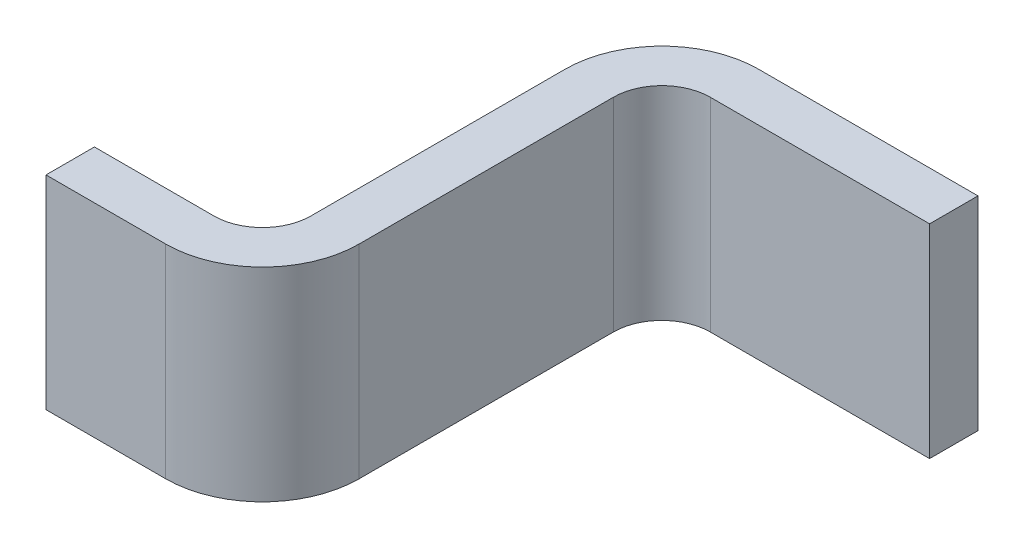
ISO-10303-21;
HEADER;
FILE_DESCRIPTION(('STEP AP214'),'2;1');
FILE_NAME('part.step','',(''),(''),'','','');
FILE_SCHEMA(('AUTOMOTIVE_DESIGN { 1 0 10303 214 1 1 1 1 }'));
ENDSEC;
DATA;
#1=APPLICATION_CONTEXT('core data for automotive mechanical design processes');
#2=APPLICATION_PROTOCOL_DEFINITION('international standard','automotive_design',2000,#1);
#3=PRODUCT_CONTEXT('',#1,'mechanical');
#4=PRODUCT('Part','Part','',(#3));
#5=PRODUCT_RELATED_PRODUCT_CATEGORY('part','',(#4));
#6=PRODUCT_DEFINITION_FORMATION('','',#4);
#7=PRODUCT_DEFINITION_CONTEXT('part definition',#1,'design');
#8=PRODUCT_DEFINITION('design','',#6,#7);
#9=PRODUCT_DEFINITION_SHAPE('','',#8);
#10=(LENGTH_UNIT() NAMED_UNIT(*) SI_UNIT(.MILLI.,.METRE.));
#11=(NAMED_UNIT(*) PLANE_ANGLE_UNIT() SI_UNIT($,.RADIAN.));
#12=(NAMED_UNIT(*) SI_UNIT($,.STERADIAN.) SOLID_ANGLE_UNIT());
#13=UNCERTAINTY_MEASURE_WITH_UNIT(LENGTH_MEASURE(1.E-05),#10,'distance_accuracy_value','');
#14=(GEOMETRIC_REPRESENTATION_CONTEXT(3) GLOBAL_UNCERTAINTY_ASSIGNED_CONTEXT((#13)) GLOBAL_UNIT_ASSIGNED_CONTEXT((#10,
#11,#12)) REPRESENTATION_CONTEXT('',''));
#15=CARTESIAN_POINT('',(0.,0.,0.));
#16=DIRECTION('',(0.,0.,1.));
#17=DIRECTION('',(1.,0.,0.));
#18=AXIS2_PLACEMENT_3D('',#15,#16,#17);
#19=CARTESIAN_POINT('',(0.,0.21,0.925));
#20=DIRECTION('',(0.,0.,-1.));
#21=DIRECTION('',(-1.,0.,0.));
#22=AXIS2_PLACEMENT_3D('',#19,#20,#21);
#23=PLANE('',#22);
#24=DIRECTION('',(1.,0.,0.));
#25=VECTOR('',#24,1.);
#26=CARTESIAN_POINT('',(0.,0.21,0.925));
#27=LINE('',#26,#25);
#28=CARTESIAN_POINT('',(0.247,0.21,0.925));
#29=VERTEX_POINT('',#28);
#30=CARTESIAN_POINT('',(0.,0.21,0.925));
#31=VERTEX_POINT('',#30);
#32=EDGE_CURVE('E85',#29,#31,#27,.F.);
#33=ORIENTED_EDGE('',*,*,#32,.T.);
#34=DIRECTION('',(0.,1.,0.));
#35=VECTOR('',#34,1.);
#36=CARTESIAN_POINT('',(0.,-0.21,0.925));
#37=LINE('',#36,#35);
#38=CARTESIAN_POINT('',(0.,-0.21,0.925));
#39=VERTEX_POINT('',#38);
#40=EDGE_CURVE('E111',#39,#31,#37,.T.);
#41=ORIENTED_EDGE('',*,*,#40,.F.);
#42=DIRECTION('',(1.,0.,0.));
#43=VECTOR('',#42,1.);
#44=CARTESIAN_POINT('',(0.,-0.21,0.925));
#45=LINE('',#44,#43);
#46=CARTESIAN_POINT('',(0.247,-0.21,0.925));
#47=VERTEX_POINT('',#46);
#48=EDGE_CURVE('E130',#39,#47,#45,.T.);
#49=ORIENTED_EDGE('',*,*,#48,.T.);
#50=DIRECTION('',(0.,1.,0.));
#51=VECTOR('',#50,1.);
#52=CARTESIAN_POINT('',(0.247,0.21,0.925));
#53=LINE('',#52,#51);
#54=EDGE_CURVE('E121',#29,#47,#53,.F.);
#55=ORIENTED_EDGE('',*,*,#54,.F.);
#56=EDGE_LOOP('',(#33,#41,#49,#55));
#57=FACE_BOUND('',#56,.T.);
#58=ADVANCED_FACE('F17',(#57),#23,.F.);
#59=CARTESIAN_POINT('',(0.547,0.21,0.1));
#60=DIRECTION('',(0.,0.,-1.));
#61=DIRECTION('',(-1.,0.,0.));
#62=AXIS2_PLACEMENT_3D('',#59,#60,#61);
#63=PLANE('',#62);
#64=DIRECTION('',(1.,0.,0.));
#65=VECTOR('',#64,1.);
#66=CARTESIAN_POINT('',(0.547,0.21,0.1));
#67=LINE('',#66,#65);
#68=CARTESIAN_POINT('',(1.,0.21,0.1));
#69=VERTEX_POINT('',#68);
#70=CARTESIAN_POINT('',(0.547,0.21,0.1));
#71=VERTEX_POINT('',#70);
#72=EDGE_CURVE('E142',#69,#71,#67,.F.);
#73=ORIENTED_EDGE('',*,*,#72,.T.);
#74=DIRECTION('',(0.,-1.,0.));
#75=VECTOR('',#74,1.);
#76=CARTESIAN_POINT('',(0.547,0.21,0.1));
#77=LINE('',#76,#75);
#78=CARTESIAN_POINT('',(0.547,-0.21,0.1));
#79=VERTEX_POINT('',#78);
#80=EDGE_CURVE('E189',#71,#79,#77,.T.);
#81=ORIENTED_EDGE('',*,*,#80,.T.);
#82=DIRECTION('',(1.,0.,0.));
#83=VECTOR('',#82,1.);
#84=CARTESIAN_POINT('',(0.547,-0.21,0.1));
#85=LINE('',#84,#83);
#86=CARTESIAN_POINT('',(1.,-0.21,0.1));
#87=VERTEX_POINT('',#86);
#88=EDGE_CURVE('E193',#79,#87,#85,.T.);
#89=ORIENTED_EDGE('',*,*,#88,.T.);
#90=DIRECTION('',(0.,1.,0.));
#91=VECTOR('',#90,1.);
#92=CARTESIAN_POINT('',(1.,-0.21,0.1));
#93=LINE('',#92,#91);
#94=EDGE_CURVE('E96',#87,#69,#93,.T.);
#95=ORIENTED_EDGE('',*,*,#94,.T.);
#96=EDGE_LOOP('',(#73,#81,#89,#95));
#97=FACE_BOUND('',#96,.T.);
#98=ADVANCED_FACE('F230',(#97),#63,.F.);
#99=CARTESIAN_POINT('',(0.,-0.21,0.825));
#100=DIRECTION('',(-1.,0.,0.));
#101=DIRECTION('',(0.,0.,1.));
#102=AXIS2_PLACEMENT_3D('',#99,#100,#101);
#103=PLANE('',#102);
#104=DIRECTION('',(0.,0.,1.));
#105=VECTOR('',#104,1.);
#106=CARTESIAN_POINT('',(0.,0.21,0.825));
#107=LINE('',#106,#105);
#108=CARTESIAN_POINT('',(0.,0.21,0.825));
#109=VERTEX_POINT('',#108);
#110=EDGE_CURVE('E114',#31,#109,#107,.F.);
#111=ORIENTED_EDGE('',*,*,#110,.T.);
#112=DIRECTION('',(0.,1.,0.));
#113=VECTOR('',#112,1.);
#114=CARTESIAN_POINT('',(0.,-0.21,0.825));
#115=LINE('',#114,#113);
#116=CARTESIAN_POINT('',(0.,-0.21,0.825));
#117=VERTEX_POINT('',#116);
#118=EDGE_CURVE('E175',#109,#117,#115,.F.);
#119=ORIENTED_EDGE('',*,*,#118,.T.);
#120=DIRECTION('',(0.,0.,1.));
#121=VECTOR('',#120,1.);
#122=CARTESIAN_POINT('',(0.,-0.21,0.925));
#123=LINE('',#122,#121);
#124=EDGE_CURVE('E116',#117,#39,#123,.T.);
#125=ORIENTED_EDGE('',*,*,#124,.T.);
#126=ORIENTED_EDGE('',*,*,#40,.T.);
#127=EDGE_LOOP('',(#111,#119,#125,#126));
#128=FACE_BOUND('',#127,.T.);
#129=ADVANCED_FACE('F112',(#128),#103,.T.);
#130=CARTESIAN_POINT('',(0.247,0.21,0.725));
#131=DIRECTION('',(0.,1.,0.));
#132=DIRECTION('',(0.,0.,1.));
#133=AXIS2_PLACEMENT_3D('',#130,#131,#132);
#134=CYLINDRICAL_SURFACE('',#133,0.2);
#135=CARTESIAN_POINT('',(0.247,0.21,0.725));
#136=DIRECTION('',(0.,1.,0.));
#137=DIRECTION('',(0.,0.,1.));
#138=AXIS2_PLACEMENT_3D('',#135,#136,#137);
#139=CIRCLE('',#138,0.2);
#140=CARTESIAN_POINT('',(0.447,0.21,0.725));
#141=VERTEX_POINT('',#140);
#142=EDGE_CURVE('E20',#29,#141,#139,.T.);
#143=ORIENTED_EDGE('',*,*,#142,.F.);
#144=ORIENTED_EDGE('',*,*,#54,.T.);
#145=CARTESIAN_POINT('',(0.247,-0.21,0.725));
#146=DIRECTION('',(0.,1.,0.));
#147=DIRECTION('',(0.,0.,1.));
#148=AXIS2_PLACEMENT_3D('',#145,#146,#147);
#149=CIRCLE('',#148,0.2);
#150=CARTESIAN_POINT('',(0.447,-0.21,0.725));
#151=VERTEX_POINT('',#150);
#152=EDGE_CURVE('E166',#151,#47,#149,.F.);
#153=ORIENTED_EDGE('',*,*,#152,.F.);
#154=DIRECTION('',(0.,1.,0.));
#155=VECTOR('',#154,1.);
#156=CARTESIAN_POINT('',(0.447,0.21,0.725));
#157=LINE('',#156,#155);
#158=EDGE_CURVE('E168',#151,#141,#157,.T.);
#159=ORIENTED_EDGE('',*,*,#158,.T.);
#160=EDGE_LOOP('',(#143,#144,#153,#159));
#161=FACE_BOUND('',#160,.T.);
#162=ADVANCED_FACE('F220',(#161),#134,.T.);
#163=CARTESIAN_POINT('',(1.,-0.21,0.));
#164=DIRECTION('',(-1.,0.,0.));
#165=DIRECTION('',(0.,0.,1.));
#166=AXIS2_PLACEMENT_3D('',#163,#164,#165);
#167=PLANE('',#166);
#168=DIRECTION('',(0.,0.,1.));
#169=VECTOR('',#168,1.);
#170=CARTESIAN_POINT('',(1.,0.21,0.));
#171=LINE('',#170,#169);
#172=CARTESIAN_POINT('',(1.,0.21,0.));
#173=VERTEX_POINT('',#172);
#174=EDGE_CURVE('E141',#69,#173,#171,.F.);
#175=ORIENTED_EDGE('',*,*,#174,.F.);
#176=ORIENTED_EDGE('',*,*,#94,.F.);
#177=DIRECTION('',(0.,0.,1.));
#178=VECTOR('',#177,1.);
#179=CARTESIAN_POINT('',(1.,-0.21,0.1));
#180=LINE('',#179,#178);
#181=CARTESIAN_POINT('',(1.,-0.21,0.));
#182=VERTEX_POINT('',#181);
#183=EDGE_CURVE('E192',#87,#182,#180,.F.);
#184=ORIENTED_EDGE('',*,*,#183,.T.);
#185=DIRECTION('',(0.,1.,0.));
#186=VECTOR('',#185,1.);
#187=CARTESIAN_POINT('',(1.,-0.21,0.));
#188=LINE('',#187,#186);
#189=EDGE_CURVE('E161',#182,#173,#188,.T.);
#190=ORIENTED_EDGE('',*,*,#189,.T.);
#191=EDGE_LOOP('',(#175,#176,#184,#190));
#192=FACE_BOUND('',#191,.T.);
#193=ADVANCED_FACE('F232',(#192),#167,.F.);
#194=CARTESIAN_POINT('',(0.547,0.21,0.2));
#195=DIRECTION('',(0.,-1.,0.));
#196=DIRECTION('',(0.,0.,-1.));
#197=AXIS2_PLACEMENT_3D('',#194,#195,#196);
#198=CYLINDRICAL_SURFACE('',#197,0.1);
#199=CARTESIAN_POINT('',(0.547,0.21,0.2));
#200=DIRECTION('',(0.,-1.,0.));
#201=DIRECTION('',(0.,0.,-1.));
#202=AXIS2_PLACEMENT_3D('',#199,#200,#201);
#203=CIRCLE('',#202,0.1);
#204=CARTESIAN_POINT('',(0.447,0.21,0.2));
#205=VERTEX_POINT('',#204);
#206=EDGE_CURVE('E162',#205,#71,#203,.T.);
#207=ORIENTED_EDGE('',*,*,#206,.F.);
#208=DIRECTION('',(0.,1.,0.));
#209=VECTOR('',#208,1.);
#210=CARTESIAN_POINT('',(0.447,0.21,0.2));
#211=LINE('',#210,#209);
#212=CARTESIAN_POINT('',(0.447,-0.21,0.2));
#213=VERTEX_POINT('',#212);
#214=EDGE_CURVE('E165',#205,#213,#211,.F.);
#215=ORIENTED_EDGE('',*,*,#214,.T.);
#216=CARTESIAN_POINT('',(0.547,-0.21,0.2));
#217=DIRECTION('',(0.,-1.,0.));
#218=DIRECTION('',(0.,0.,-1.));
#219=AXIS2_PLACEMENT_3D('',#216,#217,#218);
#220=CIRCLE('',#219,0.1);
#221=EDGE_CURVE('E159',#79,#213,#220,.F.);
#222=ORIENTED_EDGE('',*,*,#221,.F.);
#223=ORIENTED_EDGE('',*,*,#80,.F.);
#224=EDGE_LOOP('',(#207,#215,#222,#223));
#225=FACE_BOUND('',#224,.T.);
#226=ADVANCED_FACE('F226',(#225),#198,.F.);
#227=CARTESIAN_POINT('',(0.,-0.21,0.825));
#228=DIRECTION('',(0.,0.,1.));
#229=DIRECTION('',(1.,0.,0.));
#230=AXIS2_PLACEMENT_3D('',#227,#228,#229);
#231=PLANE('',#230);
#232=DIRECTION('',(1.,0.,0.));
#233=VECTOR('',#232,1.);
#234=CARTESIAN_POINT('',(0.,-0.21,0.825));
#235=LINE('',#234,#233);
#236=CARTESIAN_POINT('',(0.247,-0.21,0.825));
#237=VERTEX_POINT('',#236);
#238=EDGE_CURVE('E169',#117,#237,#235,.T.);
#239=ORIENTED_EDGE('',*,*,#238,.F.);
#240=ORIENTED_EDGE('',*,*,#118,.F.);
#241=DIRECTION('',(1.,0.,0.));
#242=VECTOR('',#241,1.);
#243=CARTESIAN_POINT('',(0.,0.21,0.825));
#244=LINE('',#243,#242);
#245=CARTESIAN_POINT('',(0.247,0.21,0.825));
#246=VERTEX_POINT('',#245);
#247=EDGE_CURVE('E128',#246,#109,#244,.F.);
#248=ORIENTED_EDGE('',*,*,#247,.F.);
#249=DIRECTION('',(0.,1.,0.));
#250=VECTOR('',#249,1.);
#251=CARTESIAN_POINT('',(0.247,-0.21,0.825));
#252=LINE('',#251,#250);
#253=EDGE_CURVE('E155',#246,#237,#252,.F.);
#254=ORIENTED_EDGE('',*,*,#253,.T.);
#255=EDGE_LOOP('',(#239,#240,#248,#254));
#256=FACE_BOUND('',#255,.T.);
#257=ADVANCED_FACE('F266',(#256),#231,.F.);
#258=CARTESIAN_POINT('',(0.447,0.21,0.725));
#259=DIRECTION('',(-1.,0.,0.));
#260=DIRECTION('',(0.,0.,1.));
#261=AXIS2_PLACEMENT_3D('',#258,#259,#260);
#262=PLANE('',#261);
#263=DIRECTION('',(0.,0.,-1.));
#264=VECTOR('',#263,1.);
#265=CARTESIAN_POINT('',(0.447,0.21,0.725));
#266=LINE('',#265,#264);
#267=EDGE_CURVE('E158',#205,#141,#266,.F.);
#268=ORIENTED_EDGE('',*,*,#267,.T.);
#269=ORIENTED_EDGE('',*,*,#158,.F.);
#270=DIRECTION('',(0.,0.,1.));
#271=VECTOR('',#270,1.);
#272=CARTESIAN_POINT('',(0.447,-0.21,0.725));
#273=LINE('',#272,#271);
#274=EDGE_CURVE('E152',#151,#213,#273,.F.);
#275=ORIENTED_EDGE('',*,*,#274,.T.);
#276=ORIENTED_EDGE('',*,*,#214,.F.);
#277=EDGE_LOOP('',(#268,#269,#275,#276));
#278=FACE_BOUND('',#277,.T.);
#279=ADVANCED_FACE('F268',(#278),#262,.F.);
#280=CARTESIAN_POINT('',(0.547,-0.21,0.));
#281=DIRECTION('',(0.,0.,1.));
#282=DIRECTION('',(1.,0.,0.));
#283=AXIS2_PLACEMENT_3D('',#280,#281,#282);
#284=PLANE('',#283);
#285=DIRECTION('',(1.,0.,0.));
#286=VECTOR('',#285,1.);
#287=CARTESIAN_POINT('',(0.547,-0.21,0.));
#288=LINE('',#287,#286);
#289=CARTESIAN_POINT('',(0.547,-0.21,0.));
#290=VERTEX_POINT('',#289);
#291=EDGE_CURVE('E203',#290,#182,#288,.T.);
#292=ORIENTED_EDGE('',*,*,#291,.F.);
#293=DIRECTION('',(0.,-1.,0.));
#294=VECTOR('',#293,1.);
#295=CARTESIAN_POINT('',(0.547,-0.21,0.));
#296=LINE('',#295,#294);
#297=CARTESIAN_POINT('',(0.547,0.21,0.));
#298=VERTEX_POINT('',#297);
#299=EDGE_CURVE('E149',#298,#290,#296,.T.);
#300=ORIENTED_EDGE('',*,*,#299,.F.);
#301=DIRECTION('',(1.,0.,0.));
#302=VECTOR('',#301,1.);
#303=CARTESIAN_POINT('',(0.547,0.21,0.));
#304=LINE('',#303,#302);
#305=EDGE_CURVE('E164',#173,#298,#304,.F.);
#306=ORIENTED_EDGE('',*,*,#305,.F.);
#307=ORIENTED_EDGE('',*,*,#189,.F.);
#308=EDGE_LOOP('',(#292,#300,#306,#307));
#309=FACE_BOUND('',#308,.T.);
#310=ADVANCED_FACE('F238',(#309),#284,.F.);
#311=CARTESIAN_POINT('',(0.347,0.21,0.725));
#312=DIRECTION('',(0.,-1.,0.));
#313=DIRECTION('',(0.,0.,-1.));
#314=AXIS2_PLACEMENT_3D('',#311,#312,#313);
#315=PLANE('',#314);
#316=DIRECTION('',(0.,0.,-1.));
#317=VECTOR('',#316,1.);
#318=CARTESIAN_POINT('',(0.347,0.21,0.725));
#319=LINE('',#318,#317);
#320=CARTESIAN_POINT('',(0.347,0.21,0.2));
#321=VERTEX_POINT('',#320);
#322=CARTESIAN_POINT('',(0.347,0.21,0.725));
#323=VERTEX_POINT('',#322);
#324=EDGE_CURVE('E148',#321,#323,#319,.F.);
#325=ORIENTED_EDGE('',*,*,#324,.T.);
#326=CARTESIAN_POINT('',(0.247,0.21,0.725));
#327=DIRECTION('',(0.,1.,0.));
#328=DIRECTION('',(0.,0.,1.));
#329=AXIS2_PLACEMENT_3D('',#326,#327,#328);
#330=CIRCLE('',#329,0.1);
#331=EDGE_CURVE('E156',#323,#246,#330,.F.);
#332=ORIENTED_EDGE('',*,*,#331,.T.);
#333=ORIENTED_EDGE('',*,*,#247,.T.);
#334=ORIENTED_EDGE('',*,*,#110,.F.);
#335=ORIENTED_EDGE('',*,*,#32,.F.);
#336=ORIENTED_EDGE('',*,*,#142,.T.);
#337=ORIENTED_EDGE('',*,*,#267,.F.);
#338=ORIENTED_EDGE('',*,*,#206,.T.);
#339=ORIENTED_EDGE('',*,*,#72,.F.);
#340=ORIENTED_EDGE('',*,*,#174,.T.);
#341=ORIENTED_EDGE('',*,*,#305,.T.);
#342=CARTESIAN_POINT('',(0.547,0.21,0.2));
#343=DIRECTION('',(0.,-1.,0.));
#344=DIRECTION('',(0.,0.,-1.));
#345=AXIS2_PLACEMENT_3D('',#342,#343,#344);
#346=CIRCLE('',#345,0.2);
#347=EDGE_CURVE('E150',#321,#298,#346,.T.);
#348=ORIENTED_EDGE('',*,*,#347,.F.);
#349=EDGE_LOOP('',(#325,#332,#333,#334,#335,#336,#337,#338,#339,#340,#341,#348));
#350=FACE_BOUND('',#349,.T.);
#351=ADVANCED_FACE('F126',(#350),#315,.F.);
#352=CARTESIAN_POINT('',(0.247,-0.21,0.725));
#353=DIRECTION('',(0.,1.,0.));
#354=DIRECTION('',(0.,0.,1.));
#355=AXIS2_PLACEMENT_3D('',#352,#353,#354);
#356=CYLINDRICAL_SURFACE('',#355,0.1);
#357=CARTESIAN_POINT('',(0.247,-0.21,0.725));
#358=DIRECTION('',(0.,1.,0.));
#359=DIRECTION('',(0.,0.,1.));
#360=AXIS2_PLACEMENT_3D('',#357,#358,#359);
#361=CIRCLE('',#360,0.1);
#362=CARTESIAN_POINT('',(0.347,-0.21,0.725));
#363=VERTEX_POINT('',#362);
#364=EDGE_CURVE('E153',#237,#363,#361,.T.);
#365=ORIENTED_EDGE('',*,*,#364,.F.);
#366=ORIENTED_EDGE('',*,*,#253,.F.);
#367=ORIENTED_EDGE('',*,*,#331,.F.);
#368=DIRECTION('',(0.,1.,0.));
#369=VECTOR('',#368,1.);
#370=CARTESIAN_POINT('',(0.347,-0.21,0.725));
#371=LINE('',#370,#369);
#372=EDGE_CURVE('E251',#323,#363,#371,.F.);
#373=ORIENTED_EDGE('',*,*,#372,.T.);
#374=EDGE_LOOP('',(#365,#366,#367,#373));
#375=FACE_BOUND('',#374,.T.);
#376=ADVANCED_FACE('F263',(#375),#356,.F.);
#377=CARTESIAN_POINT('',(0.447,-0.21,0.725));
#378=DIRECTION('',(0.,1.,0.));
#379=DIRECTION('',(0.,0.,1.));
#380=AXIS2_PLACEMENT_3D('',#377,#378,#379);
#381=PLANE('',#380);
#382=ORIENTED_EDGE('',*,*,#274,.F.);
#383=ORIENTED_EDGE('',*,*,#152,.T.);
#384=ORIENTED_EDGE('',*,*,#48,.F.);
#385=ORIENTED_EDGE('',*,*,#124,.F.);
#386=ORIENTED_EDGE('',*,*,#238,.T.);
#387=ORIENTED_EDGE('',*,*,#364,.T.);
#388=DIRECTION('',(0.,0.,-1.));
#389=VECTOR('',#388,1.);
#390=CARTESIAN_POINT('',(0.347,-0.21,0.725));
#391=LINE('',#390,#389);
#392=CARTESIAN_POINT('',(0.347,-0.21,0.2));
#393=VERTEX_POINT('',#392);
#394=EDGE_CURVE('E26',#363,#393,#391,.T.);
#395=ORIENTED_EDGE('',*,*,#394,.T.);
#396=CARTESIAN_POINT('',(0.547,-0.21,0.2));
#397=DIRECTION('',(0.,-1.,0.));
#398=DIRECTION('',(0.,0.,-1.));
#399=AXIS2_PLACEMENT_3D('',#396,#397,#398);
#400=CIRCLE('',#399,0.2);
#401=EDGE_CURVE('E34',#290,#393,#400,.F.);
#402=ORIENTED_EDGE('',*,*,#401,.F.);
#403=ORIENTED_EDGE('',*,*,#291,.T.);
#404=ORIENTED_EDGE('',*,*,#183,.F.);
#405=ORIENTED_EDGE('',*,*,#88,.F.);
#406=ORIENTED_EDGE('',*,*,#221,.T.);
#407=EDGE_LOOP('',(#382,#383,#384,#385,#386,#387,#395,#402,#403,#404,#405,#406));
#408=FACE_BOUND('',#407,.T.);
#409=ADVANCED_FACE('F240',(#408),#381,.F.);
#410=CARTESIAN_POINT('',(0.547,-0.21,0.2));
#411=DIRECTION('',(0.,-1.,0.));
#412=DIRECTION('',(0.,0.,-1.));
#413=AXIS2_PLACEMENT_3D('',#410,#411,#412);
#414=CYLINDRICAL_SURFACE('',#413,0.2);
#415=ORIENTED_EDGE('',*,*,#401,.T.);
#416=DIRECTION('',(0.,1.,0.));
#417=VECTOR('',#416,1.);
#418=CARTESIAN_POINT('',(0.347,-0.21,0.2));
#419=LINE('',#418,#417);
#420=EDGE_CURVE('E11',#393,#321,#419,.T.);
#421=ORIENTED_EDGE('',*,*,#420,.T.);
#422=ORIENTED_EDGE('',*,*,#347,.T.);
#423=ORIENTED_EDGE('',*,*,#299,.T.);
#424=EDGE_LOOP('',(#415,#421,#422,#423));
#425=FACE_BOUND('',#424,.T.);
#426=ADVANCED_FACE('F260',(#425),#414,.T.);
#427=CARTESIAN_POINT('',(0.347,-0.21,0.725));
#428=DIRECTION('',(1.,0.,0.));
#429=DIRECTION('',(0.,0.,-1.));
#430=AXIS2_PLACEMENT_3D('',#427,#428,#429);
#431=PLANE('',#430);
#432=ORIENTED_EDGE('',*,*,#394,.F.);
#433=ORIENTED_EDGE('',*,*,#372,.F.);
#434=ORIENTED_EDGE('',*,*,#324,.F.);
#435=ORIENTED_EDGE('',*,*,#420,.F.);
#436=EDGE_LOOP('',(#432,#433,#434,#435));
#437=FACE_BOUND('',#436,.T.);
#438=ADVANCED_FACE('F258',(#437),#431,.F.);
#439=CLOSED_SHELL('',(#58,#98,#129,#162,#193,#226,#257,#279,#310,#351,#376,#409,#426,#438));
#440=MANIFOLD_SOLID_BREP('B1',#439);
#441=ADVANCED_BREP_SHAPE_REPRESENTATION('',(#18,#440),#14);
#442=SHAPE_DEFINITION_REPRESENTATION(#9,#441);
ENDSEC;
END-ISO-10303-21;
